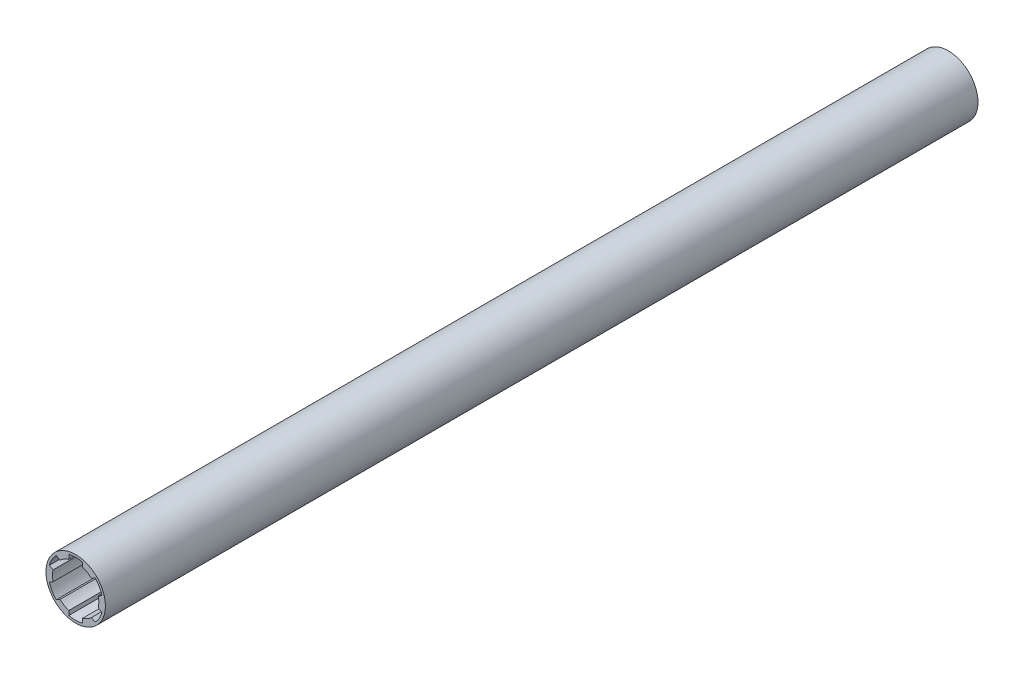
ISO-10303-21;
HEADER;
FILE_DESCRIPTION(('STEP AP214'),'2;1');
FILE_NAME('part.step','',(''),(''),'','','');
FILE_SCHEMA(('AUTOMOTIVE_DESIGN { 1 0 10303 214 1 1 1 1 }'));
ENDSEC;
DATA;
#1=APPLICATION_CONTEXT('core data for automotive mechanical design processes');
#2=APPLICATION_PROTOCOL_DEFINITION('international standard','automotive_design',2000,#1);
#3=PRODUCT_CONTEXT('',#1,'mechanical');
#4=PRODUCT('Part','Part','',(#3));
#5=PRODUCT_RELATED_PRODUCT_CATEGORY('part','',(#4));
#6=PRODUCT_DEFINITION_FORMATION('','',#4);
#7=PRODUCT_DEFINITION_CONTEXT('part definition',#1,'design');
#8=PRODUCT_DEFINITION('design','',#6,#7);
#9=PRODUCT_DEFINITION_SHAPE('','',#8);
#10=(LENGTH_UNIT() NAMED_UNIT(*) SI_UNIT(.MILLI.,.METRE.));
#11=(NAMED_UNIT(*) PLANE_ANGLE_UNIT() SI_UNIT($,.RADIAN.));
#12=(NAMED_UNIT(*) SI_UNIT($,.STERADIAN.) SOLID_ANGLE_UNIT());
#13=UNCERTAINTY_MEASURE_WITH_UNIT(LENGTH_MEASURE(1.E-05),#10,'distance_accuracy_value','');
#14=(GEOMETRIC_REPRESENTATION_CONTEXT(3) GLOBAL_UNCERTAINTY_ASSIGNED_CONTEXT((#13)) GLOBAL_UNIT_ASSIGNED_CONTEXT((#10,
#11,#12)) REPRESENTATION_CONTEXT('',''));
#15=CARTESIAN_POINT('',(0.,0.,0.));
#16=DIRECTION('',(0.,0.,1.));
#17=DIRECTION('',(1.,0.,0.));
#18=AXIS2_PLACEMENT_3D('',#15,#16,#17);
#19=CARTESIAN_POINT('',(0.,0.,558.8));
#20=DIRECTION('',(0.,0.,-1.));
#21=DIRECTION('',(-1.,0.,0.));
#22=AXIS2_PLACEMENT_3D('',#19,#20,#21);
#23=CYLINDRICAL_SURFACE('',#22,14.825);
#24=CARTESIAN_POINT('',(0.,0.,0.));
#25=DIRECTION('',(0.,0.,1.));
#26=DIRECTION('',(1.,0.,0.));
#27=AXIS2_PLACEMENT_3D('',#24,#25,#26);
#28=CIRCLE('',#27,14.825);
#29=CARTESIAN_POINT('',(-14.4533655696266,3.29861314960284,0.));
#30=VERTEX_POINT('',#29);
#31=CARTESIAN_POINT('',(-14.4533655696267,-3.29861314960254,0.));
#32=VERTEX_POINT('',#31);
#33=EDGE_CURVE('E227',#30,#32,#28,.T.);
#34=ORIENTED_EDGE('',*,*,#33,.F.);
#35=DIRECTION('',(0.,0.,-1.));
#36=VECTOR('',#35,1.);
#37=CARTESIAN_POINT('',(-14.4533655696266,3.29861314960284,558.8));
#38=LINE('',#37,#36);
#39=CARTESIAN_POINT('',(-14.4533655696266,3.29861314960284,558.8));
#40=VERTEX_POINT('',#39);
#41=EDGE_CURVE('E11',#40,#30,#38,.T.);
#42=ORIENTED_EDGE('',*,*,#41,.F.);
#43=CARTESIAN_POINT('',(0.,0.,558.8));
#44=DIRECTION('',(0.,0.,1.));
#45=DIRECTION('',(1.,0.,0.));
#46=AXIS2_PLACEMENT_3D('',#43,#44,#45);
#47=CIRCLE('',#46,14.825);
#48=CARTESIAN_POINT('',(-14.4533655696267,-3.29861314960254,558.8));
#49=VERTEX_POINT('',#48);
#50=EDGE_CURVE('E296',#40,#49,#47,.T.);
#51=ORIENTED_EDGE('',*,*,#50,.T.);
#52=DIRECTION('',(0.,0.,-1.));
#53=VECTOR('',#52,1.);
#54=CARTESIAN_POINT('',(-14.4533655696267,-3.29861314960254,558.8));
#55=LINE('',#54,#53);
#56=EDGE_CURVE('E133',#49,#32,#55,.T.);
#57=ORIENTED_EDGE('',*,*,#56,.T.);
#58=EDGE_LOOP('',(#34,#42,#51,#57));
#59=FACE_BOUND('',#58,.T.);
#60=ADVANCED_FACE('F35',(#59),#23,.F.);
#61=CARTESIAN_POINT('',(-2.18500000000005,-3.78453101453798,558.8));
#62=DIRECTION('',(0.500000000000011,0.866025403784432,0.));
#63=DIRECTION('',(-0.866025403784432,0.500000000000011,0.));
#64=AXIS2_PLACEMENT_3D('',#61,#62,#63);
#65=PLANE('',#64);
#66=DIRECTION('',(0.866025403784432,-0.500000000000011,0.));
#67=VECTOR('',#66,1.);
#68=CARTESIAN_POINT('',(-2.18500000000005,-3.78453101453798,0.));
#69=LINE('',#68,#67);
#70=CARTESIAN_POINT('',(-16.8379534139025,4.67535558340191,0.));
#71=VERTEX_POINT('',#70);
#72=EDGE_CURVE('E230',#71,#30,#69,.T.);
#73=ORIENTED_EDGE('',*,*,#72,.F.);
#74=DIRECTION('',(0.,0.,-1.));
#75=VECTOR('',#74,1.);
#76=CARTESIAN_POINT('',(-16.8379534139025,4.67535558340191,558.8));
#77=LINE('',#76,#75);
#78=CARTESIAN_POINT('',(-16.8379534139025,4.67535558340191,558.8));
#79=VERTEX_POINT('',#78);
#80=EDGE_CURVE('E43',#79,#71,#77,.T.);
#81=ORIENTED_EDGE('',*,*,#80,.F.);
#82=DIRECTION('',(0.866025403784432,-0.500000000000011,0.));
#83=VECTOR('',#82,1.);
#84=CARTESIAN_POINT('',(-2.18500000000005,-3.78453101453798,558.8));
#85=LINE('',#84,#83);
#86=EDGE_CURVE('E360',#79,#40,#85,.T.);
#87=ORIENTED_EDGE('',*,*,#86,.T.);
#88=ORIENTED_EDGE('',*,*,#41,.T.);
#89=EDGE_LOOP('',(#73,#81,#87,#88));
#90=FACE_BOUND('',#89,.T.);
#91=ADVANCED_FACE('F345',(#90),#65,.T.);
#92=CARTESIAN_POINT('',(0.,0.,558.8));
#93=DIRECTION('',(0.,0.,-1.));
#94=DIRECTION('',(-1.,0.,0.));
#95=AXIS2_PLACEMENT_3D('',#92,#93,#94);
#96=CYLINDRICAL_SURFACE('',#95,17.475);
#97=CARTESIAN_POINT('',(0.,0.,0.));
#98=DIRECTION('',(0.,0.,1.));
#99=DIRECTION('',(1.,0.,0.));
#100=AXIS2_PLACEMENT_3D('',#97,#98,#99);
#101=CIRCLE('',#100,17.475);
#102=CARTESIAN_POINT('',(-12.4679534139025,12.2444176124779,0.));
#103=VERTEX_POINT('',#102);
#104=EDGE_CURVE('E233',#103,#71,#101,.T.);
#105=ORIENTED_EDGE('',*,*,#104,.F.);
#106=DIRECTION('',(0.,0.,-1.));
#107=VECTOR('',#106,1.);
#108=CARTESIAN_POINT('',(-12.4679534139025,12.2444176124779,558.8));
#109=LINE('',#108,#107);
#110=CARTESIAN_POINT('',(-12.4679534139025,12.2444176124779,558.8));
#111=VERTEX_POINT('',#110);
#112=EDGE_CURVE('E334',#111,#103,#109,.T.);
#113=ORIENTED_EDGE('',*,*,#112,.F.);
#114=CARTESIAN_POINT('',(0.,0.,558.8));
#115=DIRECTION('',(0.,0.,1.));
#116=DIRECTION('',(1.,0.,0.));
#117=AXIS2_PLACEMENT_3D('',#114,#115,#116);
#118=CIRCLE('',#117,17.475);
#119=EDGE_CURVE('E341',#111,#79,#118,.T.);
#120=ORIENTED_EDGE('',*,*,#119,.T.);
#121=ORIENTED_EDGE('',*,*,#80,.T.);
#122=EDGE_LOOP('',(#105,#113,#120,#121));
#123=FACE_BOUND('',#122,.T.);
#124=ADVANCED_FACE('F339',(#123),#96,.F.);
#125=CARTESIAN_POINT('',(2.18500000000004,3.78453101453796,558.8));
#126=DIRECTION('',(0.500000000000011,0.866025403784432,0.));
#127=DIRECTION('',(-0.866025403784433,0.500000000000011,0.));
#128=AXIS2_PLACEMENT_3D('',#125,#126,#127);
#129=PLANE('',#128);
#130=DIRECTION('',(0.866025403784433,-0.500000000000011,0.));
#131=VECTOR('',#130,1.);
#132=CARTESIAN_POINT('',(2.18500000000004,3.78453101453796,0.));
#133=LINE('',#132,#131);
#134=CARTESIAN_POINT('',(-10.0833655696265,10.8676751786788,0.));
#135=VERTEX_POINT('',#134);
#136=EDGE_CURVE('E236',#103,#135,#133,.T.);
#137=ORIENTED_EDGE('',*,*,#136,.T.);
#138=DIRECTION('',(0.,0.,-1.));
#139=VECTOR('',#138,1.);
#140=CARTESIAN_POINT('',(-10.0833655696265,10.8676751786788,558.8));
#141=LINE('',#140,#139);
#142=CARTESIAN_POINT('',(-10.0833655696265,10.8676751786788,558.8));
#143=VERTEX_POINT('',#142);
#144=EDGE_CURVE('E332',#143,#135,#141,.T.);
#145=ORIENTED_EDGE('',*,*,#144,.F.);
#146=DIRECTION('',(0.866025403784433,-0.500000000000011,0.));
#147=VECTOR('',#146,1.);
#148=CARTESIAN_POINT('',(2.18500000000004,3.78453101453796,558.8));
#149=LINE('',#148,#147);
#150=EDGE_CURVE('E356',#111,#143,#149,.T.);
#151=ORIENTED_EDGE('',*,*,#150,.F.);
#152=ORIENTED_EDGE('',*,*,#112,.T.);
#153=EDGE_LOOP('',(#137,#145,#151,#152));
#154=FACE_BOUND('',#153,.T.);
#155=ADVANCED_FACE('F353',(#154),#129,.F.);
#156=CARTESIAN_POINT('',(0.,0.,558.8));
#157=DIRECTION('',(0.,0.,-1.));
#158=DIRECTION('',(-1.,0.,0.));
#159=AXIS2_PLACEMENT_3D('',#156,#157,#158);
#160=CYLINDRICAL_SURFACE('',#159,14.825);
#161=CARTESIAN_POINT('',(0.,0.,0.));
#162=DIRECTION('',(0.,0.,1.));
#163=DIRECTION('',(1.,0.,0.));
#164=AXIS2_PLACEMENT_3D('',#161,#162,#163);
#165=CIRCLE('',#164,14.825);
#166=CARTESIAN_POINT('',(-4.37,14.1662883282813,0.));
#167=VERTEX_POINT('',#166);
#168=EDGE_CURVE('E239',#167,#135,#165,.T.);
#169=ORIENTED_EDGE('',*,*,#168,.F.);
#170=DIRECTION('',(0.,0.,-1.));
#171=VECTOR('',#170,1.);
#172=CARTESIAN_POINT('',(-4.37,14.1662883282813,558.8));
#173=LINE('',#172,#171);
#174=CARTESIAN_POINT('',(-4.37,14.1662883282813,558.8));
#175=VERTEX_POINT('',#174);
#176=EDGE_CURVE('E330',#175,#167,#173,.T.);
#177=ORIENTED_EDGE('',*,*,#176,.F.);
#178=CARTESIAN_POINT('',(0.,0.,558.8));
#179=DIRECTION('',(0.,0.,1.));
#180=DIRECTION('',(1.,0.,0.));
#181=AXIS2_PLACEMENT_3D('',#178,#179,#180);
#182=CIRCLE('',#181,14.825);
#183=EDGE_CURVE('E358',#175,#143,#182,.T.);
#184=ORIENTED_EDGE('',*,*,#183,.T.);
#185=ORIENTED_EDGE('',*,*,#144,.T.);
#186=EDGE_LOOP('',(#169,#177,#184,#185));
#187=FACE_BOUND('',#186,.T.);
#188=ADVANCED_FACE('F421',(#187),#160,.F.);
#189=CARTESIAN_POINT('',(-4.37,0.,558.8));
#190=DIRECTION('',(1.,0.,0.));
#191=DIRECTION('',(0.,0.,-1.));
#192=AXIS2_PLACEMENT_3D('',#189,#190,#191);
#193=PLANE('',#192);
#194=DIRECTION('',(0.,-1.,0.));
#195=VECTOR('',#194,1.);
#196=CARTESIAN_POINT('',(-4.37,0.,0.));
#197=LINE('',#196,#195);
#198=CARTESIAN_POINT('',(-4.37,16.9197731958794,0.));
#199=VERTEX_POINT('',#198);
#200=EDGE_CURVE('E242',#199,#167,#197,.T.);
#201=ORIENTED_EDGE('',*,*,#200,.F.);
#202=DIRECTION('',(0.,0.,-1.));
#203=VECTOR('',#202,1.);
#204=CARTESIAN_POINT('',(-4.37,16.9197731958794,558.8));
#205=LINE('',#204,#203);
#206=CARTESIAN_POINT('',(-4.37,16.9197731958794,558.8));
#207=VERTEX_POINT('',#206);
#208=EDGE_CURVE('E328',#207,#199,#205,.T.);
#209=ORIENTED_EDGE('',*,*,#208,.F.);
#210=DIRECTION('',(0.,-1.,0.));
#211=VECTOR('',#210,1.);
#212=CARTESIAN_POINT('',(-4.37,0.,558.8));
#213=LINE('',#212,#211);
#214=EDGE_CURVE('E366',#207,#175,#213,.T.);
#215=ORIENTED_EDGE('',*,*,#214,.T.);
#216=ORIENTED_EDGE('',*,*,#176,.T.);
#217=EDGE_LOOP('',(#201,#209,#215,#216));
#218=FACE_BOUND('',#217,.T.);
#219=ADVANCED_FACE('F424',(#218),#193,.T.);
#220=CARTESIAN_POINT('',(0.,0.,558.8));
#221=DIRECTION('',(0.,0.,-1.));
#222=DIRECTION('',(-1.,0.,0.));
#223=AXIS2_PLACEMENT_3D('',#220,#221,#222);
#224=CYLINDRICAL_SURFACE('',#223,17.475);
#225=CARTESIAN_POINT('',(0.,0.,0.));
#226=DIRECTION('',(0.,0.,1.));
#227=DIRECTION('',(1.,0.,0.));
#228=AXIS2_PLACEMENT_3D('',#225,#226,#227);
#229=CIRCLE('',#228,17.475);
#230=CARTESIAN_POINT('',(4.37,16.9197731958794,0.));
#231=VERTEX_POINT('',#230);
#232=EDGE_CURVE('E245',#231,#199,#229,.T.);
#233=ORIENTED_EDGE('',*,*,#232,.F.);
#234=DIRECTION('',(0.,0.,-1.));
#235=VECTOR('',#234,1.);
#236=CARTESIAN_POINT('',(4.37,16.9197731958794,558.8));
#237=LINE('',#236,#235);
#238=CARTESIAN_POINT('',(4.37,16.9197731958794,558.8));
#239=VERTEX_POINT('',#238);
#240=EDGE_CURVE('E326',#239,#231,#237,.T.);
#241=ORIENTED_EDGE('',*,*,#240,.F.);
#242=CARTESIAN_POINT('',(0.,0.,558.8));
#243=DIRECTION('',(0.,0.,1.));
#244=DIRECTION('',(1.,0.,0.));
#245=AXIS2_PLACEMENT_3D('',#242,#243,#244);
#246=CIRCLE('',#245,17.475);
#247=EDGE_CURVE('E369',#239,#207,#246,.T.);
#248=ORIENTED_EDGE('',*,*,#247,.T.);
#249=ORIENTED_EDGE('',*,*,#208,.T.);
#250=EDGE_LOOP('',(#233,#241,#248,#249));
#251=FACE_BOUND('',#250,.T.);
#252=ADVANCED_FACE('F428',(#251),#224,.F.);
#253=CARTESIAN_POINT('',(4.37,0.,558.8));
#254=DIRECTION('',(1.,0.,0.));
#255=DIRECTION('',(0.,0.,-1.));
#256=AXIS2_PLACEMENT_3D('',#253,#254,#255);
#257=PLANE('',#256);
#258=DIRECTION('',(0.,-1.,0.));
#259=VECTOR('',#258,1.);
#260=CARTESIAN_POINT('',(4.37,0.,0.));
#261=LINE('',#260,#259);
#262=CARTESIAN_POINT('',(4.37,14.1662883282813,0.));
#263=VERTEX_POINT('',#262);
#264=EDGE_CURVE('E248',#231,#263,#261,.T.);
#265=ORIENTED_EDGE('',*,*,#264,.T.);
#266=DIRECTION('',(0.,0.,-1.));
#267=VECTOR('',#266,1.);
#268=CARTESIAN_POINT('',(4.37,14.1662883282813,558.8));
#269=LINE('',#268,#267);
#270=CARTESIAN_POINT('',(4.37,14.1662883282813,558.8));
#271=VERTEX_POINT('',#270);
#272=EDGE_CURVE('E324',#271,#263,#269,.T.);
#273=ORIENTED_EDGE('',*,*,#272,.F.);
#274=DIRECTION('',(0.,-1.,0.));
#275=VECTOR('',#274,1.);
#276=CARTESIAN_POINT('',(4.37,0.,558.8));
#277=LINE('',#276,#275);
#278=EDGE_CURVE('E372',#239,#271,#277,.T.);
#279=ORIENTED_EDGE('',*,*,#278,.F.);
#280=ORIENTED_EDGE('',*,*,#240,.T.);
#281=EDGE_LOOP('',(#265,#273,#279,#280));
#282=FACE_BOUND('',#281,.T.);
#283=ADVANCED_FACE('F432',(#282),#257,.F.);
#284=CARTESIAN_POINT('',(0.,0.,558.8));
#285=DIRECTION('',(0.,0.,-1.));
#286=DIRECTION('',(-1.,0.,0.));
#287=AXIS2_PLACEMENT_3D('',#284,#285,#286);
#288=CYLINDRICAL_SURFACE('',#287,14.825);
#289=CARTESIAN_POINT('',(0.,0.,0.));
#290=DIRECTION('',(0.,0.,1.));
#291=DIRECTION('',(1.,0.,0.));
#292=AXIS2_PLACEMENT_3D('',#289,#290,#291);
#293=CIRCLE('',#292,14.825);
#294=CARTESIAN_POINT('',(10.0833655696267,10.8676751786786,0.));
#295=VERTEX_POINT('',#294);
#296=EDGE_CURVE('E251',#295,#263,#293,.T.);
#297=ORIENTED_EDGE('',*,*,#296,.F.);
#298=DIRECTION('',(0.,0.,-1.));
#299=VECTOR('',#298,1.);
#300=CARTESIAN_POINT('',(10.0833655696267,10.8676751786786,558.8));
#301=LINE('',#300,#299);
#302=CARTESIAN_POINT('',(10.0833655696267,10.8676751786786,558.8));
#303=VERTEX_POINT('',#302);
#304=EDGE_CURVE('E322',#303,#295,#301,.T.);
#305=ORIENTED_EDGE('',*,*,#304,.F.);
#306=CARTESIAN_POINT('',(0.,0.,558.8));
#307=DIRECTION('',(0.,0.,1.));
#308=DIRECTION('',(1.,0.,0.));
#309=AXIS2_PLACEMENT_3D('',#306,#307,#308);
#310=CIRCLE('',#309,14.825);
#311=EDGE_CURVE('E374',#303,#271,#310,.T.);
#312=ORIENTED_EDGE('',*,*,#311,.T.);
#313=ORIENTED_EDGE('',*,*,#272,.T.);
#314=EDGE_LOOP('',(#297,#305,#312,#313));
#315=FACE_BOUND('',#314,.T.);
#316=ADVANCED_FACE('F436',(#315),#288,.F.);
#317=CARTESIAN_POINT('',(-2.18499999999999,3.784531014538,558.8));
#318=DIRECTION('',(0.499999999999998,-0.86602540378444,0.));
#319=DIRECTION('',(0.86602540378444,0.499999999999998,0.));
#320=AXIS2_PLACEMENT_3D('',#317,#318,#319);
#321=PLANE('',#320);
#322=DIRECTION('',(-0.86602540378444,-0.499999999999998,0.));
#323=VECTOR('',#322,1.);
#324=CARTESIAN_POINT('',(-2.18499999999999,3.784531014538,0.));
#325=LINE('',#324,#323);
#326=CARTESIAN_POINT('',(12.4679534139026,12.2444176124777,0.));
#327=VERTEX_POINT('',#326);
#328=EDGE_CURVE('E254',#327,#295,#325,.T.);
#329=ORIENTED_EDGE('',*,*,#328,.F.);
#330=DIRECTION('',(0.,0.,-1.));
#331=VECTOR('',#330,1.);
#332=CARTESIAN_POINT('',(12.4679534139026,12.2444176124777,558.8));
#333=LINE('',#332,#331);
#334=CARTESIAN_POINT('',(12.4679534139026,12.2444176124777,558.8));
#335=VERTEX_POINT('',#334);
#336=EDGE_CURVE('E320',#335,#327,#333,.T.);
#337=ORIENTED_EDGE('',*,*,#336,.F.);
#338=DIRECTION('',(-0.86602540378444,-0.499999999999998,0.));
#339=VECTOR('',#338,1.);
#340=CARTESIAN_POINT('',(-2.18499999999999,3.784531014538,558.8));
#341=LINE('',#340,#339);
#342=EDGE_CURVE('E377',#335,#303,#341,.T.);
#343=ORIENTED_EDGE('',*,*,#342,.T.);
#344=ORIENTED_EDGE('',*,*,#304,.T.);
#345=EDGE_LOOP('',(#329,#337,#343,#344));
#346=FACE_BOUND('',#345,.T.);
#347=ADVANCED_FACE('F440',(#346),#321,.T.);
#348=CARTESIAN_POINT('',(0.,0.,558.8));
#349=DIRECTION('',(0.,0.,-1.));
#350=DIRECTION('',(-1.,0.,0.));
#351=AXIS2_PLACEMENT_3D('',#348,#349,#350);
#352=CYLINDRICAL_SURFACE('',#351,17.475);
#353=CARTESIAN_POINT('',(0.,0.,0.));
#354=DIRECTION('',(0.,0.,1.));
#355=DIRECTION('',(1.,0.,0.));
#356=AXIS2_PLACEMENT_3D('',#353,#354,#355);
#357=CIRCLE('',#356,17.475);
#358=CARTESIAN_POINT('',(16.8379534139026,4.67535558340168,0.));
#359=VERTEX_POINT('',#358);
#360=EDGE_CURVE('E257',#359,#327,#357,.T.);
#361=ORIENTED_EDGE('',*,*,#360,.F.);
#362=DIRECTION('',(0.,0.,-1.));
#363=VECTOR('',#362,1.);
#364=CARTESIAN_POINT('',(16.8379534139026,4.67535558340168,558.8));
#365=LINE('',#364,#363);
#366=CARTESIAN_POINT('',(16.8379534139026,4.67535558340168,558.8));
#367=VERTEX_POINT('',#366);
#368=EDGE_CURVE('E318',#367,#359,#365,.T.);
#369=ORIENTED_EDGE('',*,*,#368,.F.);
#370=CARTESIAN_POINT('',(0.,0.,558.8));
#371=DIRECTION('',(0.,0.,1.));
#372=DIRECTION('',(1.,0.,0.));
#373=AXIS2_PLACEMENT_3D('',#370,#371,#372);
#374=CIRCLE('',#373,17.475);
#375=EDGE_CURVE('E380',#367,#335,#374,.T.);
#376=ORIENTED_EDGE('',*,*,#375,.T.);
#377=ORIENTED_EDGE('',*,*,#336,.T.);
#378=EDGE_LOOP('',(#361,#369,#376,#377));
#379=FACE_BOUND('',#378,.T.);
#380=ADVANCED_FACE('F444',(#379),#352,.F.);
#381=CARTESIAN_POINT('',(2.18499999999999,-3.784531014538,558.8));
#382=DIRECTION('',(0.499999999999998,-0.86602540378444,0.));
#383=DIRECTION('',(0.86602540378444,0.499999999999998,0.));
#384=AXIS2_PLACEMENT_3D('',#381,#382,#383);
#385=PLANE('',#384);
#386=DIRECTION('',(-0.86602540378444,-0.499999999999998,0.));
#387=VECTOR('',#386,1.);
#388=CARTESIAN_POINT('',(2.18499999999999,-3.784531014538,0.));
#389=LINE('',#388,#387);
#390=CARTESIAN_POINT('',(14.4533655696266,3.29861314960264,0.));
#391=VERTEX_POINT('',#390);
#392=EDGE_CURVE('E260',#359,#391,#389,.T.);
#393=ORIENTED_EDGE('',*,*,#392,.T.);
#394=DIRECTION('',(0.,0.,-1.));
#395=VECTOR('',#394,1.);
#396=CARTESIAN_POINT('',(14.4533655696266,3.29861314960264,558.8));
#397=LINE('',#396,#395);
#398=CARTESIAN_POINT('',(14.4533655696266,3.29861314960264,558.8));
#399=VERTEX_POINT('',#398);
#400=EDGE_CURVE('E316',#399,#391,#397,.T.);
#401=ORIENTED_EDGE('',*,*,#400,.F.);
#402=DIRECTION('',(-0.86602540378444,-0.499999999999998,0.));
#403=VECTOR('',#402,1.);
#404=CARTESIAN_POINT('',(2.18499999999999,-3.784531014538,558.8));
#405=LINE('',#404,#403);
#406=EDGE_CURVE('E383',#367,#399,#405,.T.);
#407=ORIENTED_EDGE('',*,*,#406,.F.);
#408=ORIENTED_EDGE('',*,*,#368,.T.);
#409=EDGE_LOOP('',(#393,#401,#407,#408));
#410=FACE_BOUND('',#409,.T.);
#411=ADVANCED_FACE('F448',(#410),#385,.F.);
#412=CARTESIAN_POINT('',(0.,0.,558.8));
#413=DIRECTION('',(0.,0.,-1.));
#414=DIRECTION('',(-1.,0.,0.));
#415=AXIS2_PLACEMENT_3D('',#412,#413,#414);
#416=CYLINDRICAL_SURFACE('',#415,14.825);
#417=CARTESIAN_POINT('',(0.,0.,0.));
#418=DIRECTION('',(0.,0.,1.));
#419=DIRECTION('',(1.,0.,0.));
#420=AXIS2_PLACEMENT_3D('',#417,#418,#419);
#421=CIRCLE('',#420,14.825);
#422=CARTESIAN_POINT('',(14.4533655696266,-3.29861314960274,0.));
#423=VERTEX_POINT('',#422);
#424=EDGE_CURVE('E263',#423,#391,#421,.T.);
#425=ORIENTED_EDGE('',*,*,#424,.F.);
#426=DIRECTION('',(0.,0.,-1.));
#427=VECTOR('',#426,1.);
#428=CARTESIAN_POINT('',(14.4533655696266,-3.29861314960274,558.8));
#429=LINE('',#428,#427);
#430=CARTESIAN_POINT('',(14.4533655696266,-3.29861314960274,558.8));
#431=VERTEX_POINT('',#430);
#432=EDGE_CURVE('E314',#431,#423,#429,.T.);
#433=ORIENTED_EDGE('',*,*,#432,.F.);
#434=CARTESIAN_POINT('',(0.,0.,558.8));
#435=DIRECTION('',(0.,0.,1.));
#436=DIRECTION('',(1.,0.,0.));
#437=AXIS2_PLACEMENT_3D('',#434,#435,#436);
#438=CIRCLE('',#437,14.825);
#439=EDGE_CURVE('E385',#431,#399,#438,.T.);
#440=ORIENTED_EDGE('',*,*,#439,.T.);
#441=ORIENTED_EDGE('',*,*,#400,.T.);
#442=EDGE_LOOP('',(#425,#433,#440,#441));
#443=FACE_BOUND('',#442,.T.);
#444=ADVANCED_FACE('F452',(#443),#416,.F.);
#445=CARTESIAN_POINT('',(2.18500000000002,3.78453101453799,558.8));
#446=DIRECTION('',(-0.500000000000004,-0.866025403784436,0.));
#447=DIRECTION('',(0.866025403784436,-0.500000000000004,0.));
#448=AXIS2_PLACEMENT_3D('',#445,#446,#447);
#449=PLANE('',#448);
#450=DIRECTION('',(-0.866025403784436,0.500000000000004,0.));
#451=VECTOR('',#450,1.);
#452=CARTESIAN_POINT('',(2.18500000000002,3.78453101453799,0.));
#453=LINE('',#452,#451);
#454=CARTESIAN_POINT('',(16.8379534139026,-4.67535558340179,0.));
#455=VERTEX_POINT('',#454);
#456=EDGE_CURVE('E266',#455,#423,#453,.T.);
#457=ORIENTED_EDGE('',*,*,#456,.F.);
#458=DIRECTION('',(0.,0.,-1.));
#459=VECTOR('',#458,1.);
#460=CARTESIAN_POINT('',(16.8379534139026,-4.67535558340179,558.8));
#461=LINE('',#460,#459);
#462=CARTESIAN_POINT('',(16.8379534139026,-4.67535558340179,558.8));
#463=VERTEX_POINT('',#462);
#464=EDGE_CURVE('E312',#463,#455,#461,.T.);
#465=ORIENTED_EDGE('',*,*,#464,.F.);
#466=DIRECTION('',(-0.866025403784436,0.500000000000004,0.));
#467=VECTOR('',#466,1.);
#468=CARTESIAN_POINT('',(2.18500000000002,3.78453101453799,558.8));
#469=LINE('',#468,#467);
#470=EDGE_CURVE('E388',#463,#431,#469,.T.);
#471=ORIENTED_EDGE('',*,*,#470,.T.);
#472=ORIENTED_EDGE('',*,*,#432,.T.);
#473=EDGE_LOOP('',(#457,#465,#471,#472));
#474=FACE_BOUND('',#473,.T.);
#475=ADVANCED_FACE('F454',(#474),#449,.T.);
#476=CARTESIAN_POINT('',(0.,0.,558.8));
#477=DIRECTION('',(0.,0.,-1.));
#478=DIRECTION('',(-1.,0.,0.));
#479=AXIS2_PLACEMENT_3D('',#476,#477,#478);
#480=CYLINDRICAL_SURFACE('',#479,17.475);
#481=CARTESIAN_POINT('',(0.,0.,0.));
#482=DIRECTION('',(0.,0.,1.));
#483=DIRECTION('',(1.,0.,0.));
#484=AXIS2_PLACEMENT_3D('',#481,#482,#483);
#485=CIRCLE('',#484,17.475);
#486=CARTESIAN_POINT('',(12.4679534139025,-12.2444176124778,0.));
#487=VERTEX_POINT('',#486);
#488=EDGE_CURVE('E270',#487,#455,#485,.T.);
#489=ORIENTED_EDGE('',*,*,#488,.F.);
#490=DIRECTION('',(0.,0.,-1.));
#491=VECTOR('',#490,1.);
#492=CARTESIAN_POINT('',(12.4679534139025,-12.2444176124778,558.8));
#493=LINE('',#492,#491);
#494=CARTESIAN_POINT('',(12.4679534139025,-12.2444176124778,558.8));
#495=VERTEX_POINT('',#494);
#496=EDGE_CURVE('E310',#495,#487,#493,.T.);
#497=ORIENTED_EDGE('',*,*,#496,.F.);
#498=CARTESIAN_POINT('',(0.,0.,558.8));
#499=DIRECTION('',(0.,0.,1.));
#500=DIRECTION('',(1.,0.,0.));
#501=AXIS2_PLACEMENT_3D('',#498,#499,#500);
#502=CIRCLE('',#501,17.475);
#503=EDGE_CURVE('E392',#495,#463,#502,.T.);
#504=ORIENTED_EDGE('',*,*,#503,.T.);
#505=ORIENTED_EDGE('',*,*,#464,.T.);
#506=EDGE_LOOP('',(#489,#497,#504,#505));
#507=FACE_BOUND('',#506,.T.);
#508=ADVANCED_FACE('F457',(#507),#480,.F.);
#509=CARTESIAN_POINT('',(-2.18500000000002,-3.78453101453798,558.8));
#510=DIRECTION('',(-0.500000000000004,-0.866025403784436,0.));
#511=DIRECTION('',(0.866025403784436,-0.500000000000004,0.));
#512=AXIS2_PLACEMENT_3D('',#509,#510,#511);
#513=PLANE('',#512);
#514=DIRECTION('',(-0.866025403784436,0.500000000000004,0.));
#515=VECTOR('',#514,1.);
#516=CARTESIAN_POINT('',(-2.18500000000002,-3.78453101453798,0.));
#517=LINE('',#516,#515);
#518=CARTESIAN_POINT('',(10.0833655696266,-10.8676751786787,0.));
#519=VERTEX_POINT('',#518);
#520=EDGE_CURVE('E273',#487,#519,#517,.T.);
#521=ORIENTED_EDGE('',*,*,#520,.T.);
#522=DIRECTION('',(0.,0.,-1.));
#523=VECTOR('',#522,1.);
#524=CARTESIAN_POINT('',(10.0833655696266,-10.8676751786787,558.8));
#525=LINE('',#524,#523);
#526=CARTESIAN_POINT('',(10.0833655696266,-10.8676751786787,558.8));
#527=VERTEX_POINT('',#526);
#528=EDGE_CURVE('E308',#527,#519,#525,.T.);
#529=ORIENTED_EDGE('',*,*,#528,.F.);
#530=DIRECTION('',(-0.866025403784436,0.500000000000004,0.));
#531=VECTOR('',#530,1.);
#532=CARTESIAN_POINT('',(-2.18500000000002,-3.78453101453798,558.8));
#533=LINE('',#532,#531);
#534=EDGE_CURVE('E395',#495,#527,#533,.T.);
#535=ORIENTED_EDGE('',*,*,#534,.F.);
#536=ORIENTED_EDGE('',*,*,#496,.T.);
#537=EDGE_LOOP('',(#521,#529,#535,#536));
#538=FACE_BOUND('',#537,.T.);
#539=ADVANCED_FACE('F461',(#538),#513,.F.);
#540=CARTESIAN_POINT('',(4.3699999999999,-14.1662883282814,0.));
#541=VERTEX_POINT('',#540);
#542=EDGE_CURVE('E267',#541,#519,#421,.T.);
#543=ORIENTED_EDGE('',*,*,#542,.F.);
#544=DIRECTION('',(0.,0.,-1.));
#545=VECTOR('',#544,1.);
#546=CARTESIAN_POINT('',(4.3699999999999,-14.1662883282814,558.8));
#547=LINE('',#546,#545);
#548=CARTESIAN_POINT('',(4.3699999999999,-14.1662883282814,558.8));
#549=VERTEX_POINT('',#548);
#550=EDGE_CURVE('E306',#549,#541,#547,.T.);
#551=ORIENTED_EDGE('',*,*,#550,.F.);
#552=EDGE_CURVE('E389',#549,#527,#438,.T.);
#553=ORIENTED_EDGE('',*,*,#552,.T.);
#554=ORIENTED_EDGE('',*,*,#528,.T.);
#555=EDGE_LOOP('',(#543,#551,#553,#554));
#556=FACE_BOUND('',#555,.T.);
#557=ADVANCED_FACE('F465',(#556),#416,.F.);
#558=CARTESIAN_POINT('',(4.37,0.,558.8));
#559=DIRECTION('',(-1.,0.,0.));
#560=DIRECTION('',(0.,-1.,0.));
#561=AXIS2_PLACEMENT_3D('',#558,#559,#560);
#562=PLANE('',#561);
#563=DIRECTION('',(0.,1.,0.));
#564=VECTOR('',#563,1.);
#565=CARTESIAN_POINT('',(4.37,0.,0.));
#566=LINE('',#565,#564);
#567=CARTESIAN_POINT('',(4.36999999999988,-16.9197731958795,0.));
#568=VERTEX_POINT('',#567);
#569=EDGE_CURVE('E276',#568,#541,#566,.T.);
#570=ORIENTED_EDGE('',*,*,#569,.F.);
#571=DIRECTION('',(0.,0.,-1.));
#572=VECTOR('',#571,1.);
#573=CARTESIAN_POINT('',(4.36999999999988,-16.9197731958795,558.8));
#574=LINE('',#573,#572);
#575=CARTESIAN_POINT('',(4.36999999999988,-16.9197731958795,558.8));
#576=VERTEX_POINT('',#575);
#577=EDGE_CURVE('E304',#576,#568,#574,.T.);
#578=ORIENTED_EDGE('',*,*,#577,.F.);
#579=DIRECTION('',(0.,1.,0.));
#580=VECTOR('',#579,1.);
#581=CARTESIAN_POINT('',(4.37,0.,558.8));
#582=LINE('',#581,#580);
#583=EDGE_CURVE('E397',#576,#549,#582,.T.);
#584=ORIENTED_EDGE('',*,*,#583,.T.);
#585=ORIENTED_EDGE('',*,*,#550,.T.);
#586=EDGE_LOOP('',(#570,#578,#584,#585));
#587=FACE_BOUND('',#586,.T.);
#588=ADVANCED_FACE('F469',(#587),#562,.T.);
#589=CARTESIAN_POINT('',(0.,0.,558.8));
#590=DIRECTION('',(0.,0.,-1.));
#591=DIRECTION('',(-1.,0.,0.));
#592=AXIS2_PLACEMENT_3D('',#589,#590,#591);
#593=CYLINDRICAL_SURFACE('',#592,17.475);
#594=CARTESIAN_POINT('',(0.,0.,0.));
#595=DIRECTION('',(0.,0.,1.));
#596=DIRECTION('',(1.,0.,0.));
#597=AXIS2_PLACEMENT_3D('',#594,#595,#596);
#598=CIRCLE('',#597,17.475);
#599=CARTESIAN_POINT('',(-4.37000000000012,-16.9197731958794,0.));
#600=VERTEX_POINT('',#599);
#601=EDGE_CURVE('E279',#600,#568,#598,.T.);
#602=ORIENTED_EDGE('',*,*,#601,.F.);
#603=DIRECTION('',(0.,0.,-1.));
#604=VECTOR('',#603,1.);
#605=CARTESIAN_POINT('',(-4.37000000000012,-16.9197731958794,558.8));
#606=LINE('',#605,#604);
#607=CARTESIAN_POINT('',(-4.37000000000012,-16.9197731958794,558.8));
#608=VERTEX_POINT('',#607);
#609=EDGE_CURVE('E302',#608,#600,#606,.T.);
#610=ORIENTED_EDGE('',*,*,#609,.F.);
#611=CARTESIAN_POINT('',(0.,0.,558.8));
#612=DIRECTION('',(0.,0.,1.));
#613=DIRECTION('',(1.,0.,0.));
#614=AXIS2_PLACEMENT_3D('',#611,#612,#613);
#615=CIRCLE('',#614,17.475);
#616=EDGE_CURVE('E400',#608,#576,#615,.T.);
#617=ORIENTED_EDGE('',*,*,#616,.T.);
#618=ORIENTED_EDGE('',*,*,#577,.T.);
#619=EDGE_LOOP('',(#602,#610,#617,#618));
#620=FACE_BOUND('',#619,.T.);
#621=ADVANCED_FACE('F473',(#620),#593,.F.);
#622=CARTESIAN_POINT('',(-4.37,0.,558.8));
#623=DIRECTION('',(-1.,0.,0.));
#624=DIRECTION('',(0.,-1.,0.));
#625=AXIS2_PLACEMENT_3D('',#622,#623,#624);
#626=PLANE('',#625);
#627=DIRECTION('',(0.,1.,0.));
#628=VECTOR('',#627,1.);
#629=CARTESIAN_POINT('',(-4.37,0.,0.));
#630=LINE('',#629,#628);
#631=CARTESIAN_POINT('',(-4.3700000000001,-14.1662883282813,0.));
#632=VERTEX_POINT('',#631);
#633=EDGE_CURVE('E282',#600,#632,#630,.T.);
#634=ORIENTED_EDGE('',*,*,#633,.T.);
#635=DIRECTION('',(0.,0.,-1.));
#636=VECTOR('',#635,1.);
#637=CARTESIAN_POINT('',(-4.3700000000001,-14.1662883282813,558.8));
#638=LINE('',#637,#636);
#639=CARTESIAN_POINT('',(-4.3700000000001,-14.1662883282813,558.8));
#640=VERTEX_POINT('',#639);
#641=EDGE_CURVE('E300',#640,#632,#638,.T.);
#642=ORIENTED_EDGE('',*,*,#641,.F.);
#643=DIRECTION('',(0.,1.,0.));
#644=VECTOR('',#643,1.);
#645=CARTESIAN_POINT('',(-4.37,0.,558.8));
#646=LINE('',#645,#644);
#647=EDGE_CURVE('E403',#608,#640,#646,.T.);
#648=ORIENTED_EDGE('',*,*,#647,.F.);
#649=ORIENTED_EDGE('',*,*,#609,.T.);
#650=EDGE_LOOP('',(#634,#642,#648,#649));
#651=FACE_BOUND('',#650,.T.);
#652=ADVANCED_FACE('F477',(#651),#626,.F.);
#653=CARTESIAN_POINT('',(0.,0.,558.8));
#654=DIRECTION('',(0.,0.,-1.));
#655=DIRECTION('',(-1.,0.,0.));
#656=AXIS2_PLACEMENT_3D('',#653,#654,#655);
#657=CYLINDRICAL_SURFACE('',#656,14.825);
#658=CARTESIAN_POINT('',(0.,0.,0.));
#659=DIRECTION('',(0.,0.,1.));
#660=DIRECTION('',(1.,0.,0.));
#661=AXIS2_PLACEMENT_3D('',#658,#659,#660);
#662=CIRCLE('',#661,14.825);
#663=CARTESIAN_POINT('',(-10.0833655696267,-10.8676751786786,0.));
#664=VERTEX_POINT('',#663);
#665=EDGE_CURVE('E285',#664,#632,#662,.T.);
#666=ORIENTED_EDGE('',*,*,#665,.F.);
#667=DIRECTION('',(0.,0.,-1.));
#668=VECTOR('',#667,1.);
#669=CARTESIAN_POINT('',(-10.0833655696267,-10.8676751786786,558.8));
#670=LINE('',#669,#668);
#671=CARTESIAN_POINT('',(-10.0833655696267,-10.8676751786786,558.8));
#672=VERTEX_POINT('',#671);
#673=EDGE_CURVE('E210',#672,#664,#670,.T.);
#674=ORIENTED_EDGE('',*,*,#673,.F.);
#675=CARTESIAN_POINT('',(0.,0.,558.8));
#676=DIRECTION('',(0.,0.,1.));
#677=DIRECTION('',(1.,0.,0.));
#678=AXIS2_PLACEMENT_3D('',#675,#676,#677);
#679=CIRCLE('',#678,14.825);
#680=EDGE_CURVE('E217',#672,#640,#679,.T.);
#681=ORIENTED_EDGE('',*,*,#680,.T.);
#682=ORIENTED_EDGE('',*,*,#641,.T.);
#683=EDGE_LOOP('',(#666,#674,#681,#682));
#684=FACE_BOUND('',#683,.T.);
#685=ADVANCED_FACE('F406',(#684),#657,.F.);
#686=CARTESIAN_POINT('',(2.18499999999996,-3.78453101453802,558.8));
#687=DIRECTION('',(-0.499999999999992,0.866025403784443,0.));
#688=DIRECTION('',(-0.866025403784443,-0.499999999999992,0.));
#689=AXIS2_PLACEMENT_3D('',#686,#687,#688);
#690=PLANE('',#689);
#691=DIRECTION('',(0.866025403784443,0.499999999999992,0.));
#692=VECTOR('',#691,1.);
#693=CARTESIAN_POINT('',(2.18499999999996,-3.78453101453802,0.));
#694=LINE('',#693,#692);
#695=CARTESIAN_POINT('',(-12.4679534139027,-12.2444176124776,0.));
#696=VERTEX_POINT('',#695);
#697=EDGE_CURVE('E205',#696,#664,#694,.T.);
#698=ORIENTED_EDGE('',*,*,#697,.F.);
#699=DIRECTION('',(0.,0.,-1.));
#700=VECTOR('',#699,1.);
#701=CARTESIAN_POINT('',(-12.4679534139027,-12.2444176124776,558.8));
#702=LINE('',#701,#700);
#703=CARTESIAN_POINT('',(-12.4679534139027,-12.2444176124776,558.8));
#704=VERTEX_POINT('',#703);
#705=EDGE_CURVE('E200',#704,#696,#702,.T.);
#706=ORIENTED_EDGE('',*,*,#705,.F.);
#707=DIRECTION('',(0.866025403784443,0.499999999999992,0.));
#708=VECTOR('',#707,1.);
#709=CARTESIAN_POINT('',(2.18499999999996,-3.78453101453802,558.8));
#710=LINE('',#709,#708);
#711=EDGE_CURVE('E203',#704,#672,#710,.T.);
#712=ORIENTED_EDGE('',*,*,#711,.T.);
#713=ORIENTED_EDGE('',*,*,#673,.T.);
#714=EDGE_LOOP('',(#698,#706,#712,#713));
#715=FACE_BOUND('',#714,.T.);
#716=ADVANCED_FACE('F202',(#715),#690,.T.);
#717=CARTESIAN_POINT('',(0.,0.,558.8));
#718=DIRECTION('',(0.,0.,-1.));
#719=DIRECTION('',(-1.,0.,0.));
#720=AXIS2_PLACEMENT_3D('',#717,#718,#719);
#721=CYLINDRICAL_SURFACE('',#720,17.475);
#722=CARTESIAN_POINT('',(0.,0.,0.));
#723=DIRECTION('',(0.,0.,1.));
#724=DIRECTION('',(1.,0.,0.));
#725=AXIS2_PLACEMENT_3D('',#722,#723,#724);
#726=CIRCLE('',#725,17.475);
#727=CARTESIAN_POINT('',(-16.8379534139026,-4.67535558340156,0.));
#728=VERTEX_POINT('',#727);
#729=EDGE_CURVE('E289',#728,#696,#726,.T.);
#730=ORIENTED_EDGE('',*,*,#729,.F.);
#731=DIRECTION('',(0.,0.,-1.));
#732=VECTOR('',#731,1.);
#733=CARTESIAN_POINT('',(-16.8379534139026,-4.67535558340156,558.8));
#734=LINE('',#733,#732);
#735=CARTESIAN_POINT('',(-16.8379534139026,-4.67535558340156,558.8));
#736=VERTEX_POINT('',#735);
#737=EDGE_CURVE('E126',#736,#728,#734,.T.);
#738=ORIENTED_EDGE('',*,*,#737,.F.);
#739=CARTESIAN_POINT('',(0.,0.,558.8));
#740=DIRECTION('',(0.,0.,1.));
#741=DIRECTION('',(1.,0.,0.));
#742=AXIS2_PLACEMENT_3D('',#739,#740,#741);
#743=CIRCLE('',#742,17.475);
#744=EDGE_CURVE('E215',#736,#704,#743,.T.);
#745=ORIENTED_EDGE('',*,*,#744,.T.);
#746=ORIENTED_EDGE('',*,*,#705,.T.);
#747=EDGE_LOOP('',(#730,#738,#745,#746));
#748=FACE_BOUND('',#747,.T.);
#749=ADVANCED_FACE('F219',(#748),#721,.F.);
#750=CARTESIAN_POINT('',(-2.18499999999996,3.78453101453801,558.8));
#751=DIRECTION('',(-0.499999999999992,0.866025403784444,0.));
#752=DIRECTION('',(-0.866025403784444,-0.499999999999992,0.));
#753=AXIS2_PLACEMENT_3D('',#750,#751,#752);
#754=PLANE('',#753);
#755=DIRECTION('',(0.866025403784443,0.499999999999992,0.));
#756=VECTOR('',#755,1.);
#757=CARTESIAN_POINT('',(-2.18499999999996,3.78453101453801,0.));
#758=LINE('',#757,#756);
#759=EDGE_CURVE('E291',#728,#32,#758,.T.);
#760=ORIENTED_EDGE('',*,*,#759,.T.);
#761=ORIENTED_EDGE('',*,*,#56,.F.);
#762=DIRECTION('',(0.866025403784443,0.499999999999992,0.));
#763=VECTOR('',#762,1.);
#764=CARTESIAN_POINT('',(-2.18499999999996,3.78453101453801,558.8));
#765=LINE('',#764,#763);
#766=EDGE_CURVE('E51',#736,#49,#765,.T.);
#767=ORIENTED_EDGE('',*,*,#766,.F.);
#768=ORIENTED_EDGE('',*,*,#737,.T.);
#769=EDGE_LOOP('',(#760,#761,#767,#768));
#770=FACE_BOUND('',#769,.T.);
#771=ADVANCED_FACE('F409',(#770),#754,.F.);
#772=CARTESIAN_POINT('',(0.,0.,558.8));
#773=DIRECTION('',(0.,0.,-1.));
#774=DIRECTION('',(-1.,0.,0.));
#775=AXIS2_PLACEMENT_3D('',#772,#773,#774);
#776=CYLINDRICAL_SURFACE('',#775,19.04);
#777=CARTESIAN_POINT('',(0.,0.,558.8));
#778=DIRECTION('',(0.,0.,1.));
#779=DIRECTION('',(1.,0.,0.));
#780=AXIS2_PLACEMENT_3D('',#777,#778,#779);
#781=CIRCLE('',#780,19.04);
#782=CARTESIAN_POINT('',(19.04,0.,558.8));
#783=VERTEX_POINT('',#782);
#784=EDGE_CURVE('E221',#783,#783,#781,.T.);
#785=ORIENTED_EDGE('',*,*,#784,.F.);
#786=EDGE_LOOP('',(#785));
#787=FACE_BOUND('',#786,.T.);
#788=CARTESIAN_POINT('',(0.,0.,0.));
#789=DIRECTION('',(0.,0.,1.));
#790=DIRECTION('',(1.,0.,0.));
#791=AXIS2_PLACEMENT_3D('',#788,#789,#790);
#792=CIRCLE('',#791,19.04);
#793=CARTESIAN_POINT('',(19.04,0.,0.));
#794=VERTEX_POINT('',#793);
#795=EDGE_CURVE('E293',#794,#794,#792,.T.);
#796=ORIENTED_EDGE('',*,*,#795,.T.);
#797=EDGE_LOOP('',(#796));
#798=FACE_BOUND('',#797,.T.);
#799=ADVANCED_FACE('F490',(#787,#798),#776,.T.);
#800=CARTESIAN_POINT('',(0.,0.,558.8));
#801=DIRECTION('',(0.,0.,1.));
#802=DIRECTION('',(1.,0.,0.));
#803=AXIS2_PLACEMENT_3D('',#800,#801,#802);
#804=PLANE('',#803);
#805=ORIENTED_EDGE('',*,*,#50,.F.);
#806=ORIENTED_EDGE('',*,*,#86,.F.);
#807=ORIENTED_EDGE('',*,*,#119,.F.);
#808=ORIENTED_EDGE('',*,*,#150,.T.);
#809=ORIENTED_EDGE('',*,*,#183,.F.);
#810=ORIENTED_EDGE('',*,*,#214,.F.);
#811=ORIENTED_EDGE('',*,*,#247,.F.);
#812=ORIENTED_EDGE('',*,*,#278,.T.);
#813=ORIENTED_EDGE('',*,*,#311,.F.);
#814=ORIENTED_EDGE('',*,*,#342,.F.);
#815=ORIENTED_EDGE('',*,*,#375,.F.);
#816=ORIENTED_EDGE('',*,*,#406,.T.);
#817=ORIENTED_EDGE('',*,*,#439,.F.);
#818=ORIENTED_EDGE('',*,*,#470,.F.);
#819=ORIENTED_EDGE('',*,*,#503,.F.);
#820=ORIENTED_EDGE('',*,*,#534,.T.);
#821=ORIENTED_EDGE('',*,*,#552,.F.);
#822=ORIENTED_EDGE('',*,*,#583,.F.);
#823=ORIENTED_EDGE('',*,*,#616,.F.);
#824=ORIENTED_EDGE('',*,*,#647,.T.);
#825=ORIENTED_EDGE('',*,*,#680,.F.);
#826=ORIENTED_EDGE('',*,*,#711,.F.);
#827=ORIENTED_EDGE('',*,*,#744,.F.);
#828=ORIENTED_EDGE('',*,*,#766,.T.);
#829=EDGE_LOOP('',(#805,#806,#807,#808,#809,#810,#811,#812,#813,#814,#815,#816,#817,#818,#819,
#820,#821,#822,#823,#824,#825,#826,#827,#828));
#830=FACE_BOUND('',#829,.T.);
#831=ORIENTED_EDGE('',*,*,#784,.T.);
#832=EDGE_LOOP('',(#831));
#833=FACE_BOUND('',#832,.T.);
#834=ADVANCED_FACE('F213',(#830,#833),#804,.T.);
#835=CARTESIAN_POINT('',(0.,0.,0.));
#836=DIRECTION('',(0.,0.,1.));
#837=DIRECTION('',(1.,0.,0.));
#838=AXIS2_PLACEMENT_3D('',#835,#836,#837);
#839=PLANE('',#838);
#840=ORIENTED_EDGE('',*,*,#33,.T.);
#841=ORIENTED_EDGE('',*,*,#759,.F.);
#842=ORIENTED_EDGE('',*,*,#729,.T.);
#843=ORIENTED_EDGE('',*,*,#697,.T.);
#844=ORIENTED_EDGE('',*,*,#665,.T.);
#845=ORIENTED_EDGE('',*,*,#633,.F.);
#846=ORIENTED_EDGE('',*,*,#601,.T.);
#847=ORIENTED_EDGE('',*,*,#569,.T.);
#848=ORIENTED_EDGE('',*,*,#542,.T.);
#849=ORIENTED_EDGE('',*,*,#520,.F.);
#850=ORIENTED_EDGE('',*,*,#488,.T.);
#851=ORIENTED_EDGE('',*,*,#456,.T.);
#852=ORIENTED_EDGE('',*,*,#424,.T.);
#853=ORIENTED_EDGE('',*,*,#392,.F.);
#854=ORIENTED_EDGE('',*,*,#360,.T.);
#855=ORIENTED_EDGE('',*,*,#328,.T.);
#856=ORIENTED_EDGE('',*,*,#296,.T.);
#857=ORIENTED_EDGE('',*,*,#264,.F.);
#858=ORIENTED_EDGE('',*,*,#232,.T.);
#859=ORIENTED_EDGE('',*,*,#200,.T.);
#860=ORIENTED_EDGE('',*,*,#168,.T.);
#861=ORIENTED_EDGE('',*,*,#136,.F.);
#862=ORIENTED_EDGE('',*,*,#104,.T.);
#863=ORIENTED_EDGE('',*,*,#72,.T.);
#864=EDGE_LOOP('',(#840,#841,#842,#843,#844,#845,#846,#847,#848,#849,#850,#851,#852,#853,#854,
#855,#856,#857,#858,#859,#860,#861,#862,#863));
#865=FACE_BOUND('',#864,.T.);
#866=ORIENTED_EDGE('',*,*,#795,.F.);
#867=EDGE_LOOP('',(#866));
#868=FACE_BOUND('',#867,.T.);
#869=ADVANCED_FACE('F348',(#865,#868),#839,.F.);
#870=CLOSED_SHELL('',(#60,#91,#124,#155,#188,#219,#252,#283,#316,#347,#380,#411,#444,#475,#508,
#539,#557,#588,#621,#652,#685,#716,#749,#771,#799,#834,#869));
#871=MANIFOLD_SOLID_BREP('B2',#870);
#872=ADVANCED_BREP_SHAPE_REPRESENTATION('',(#18,#871),#14);
#873=SHAPE_DEFINITION_REPRESENTATION(#9,#872);
ENDSEC;
END-ISO-10303-21;
